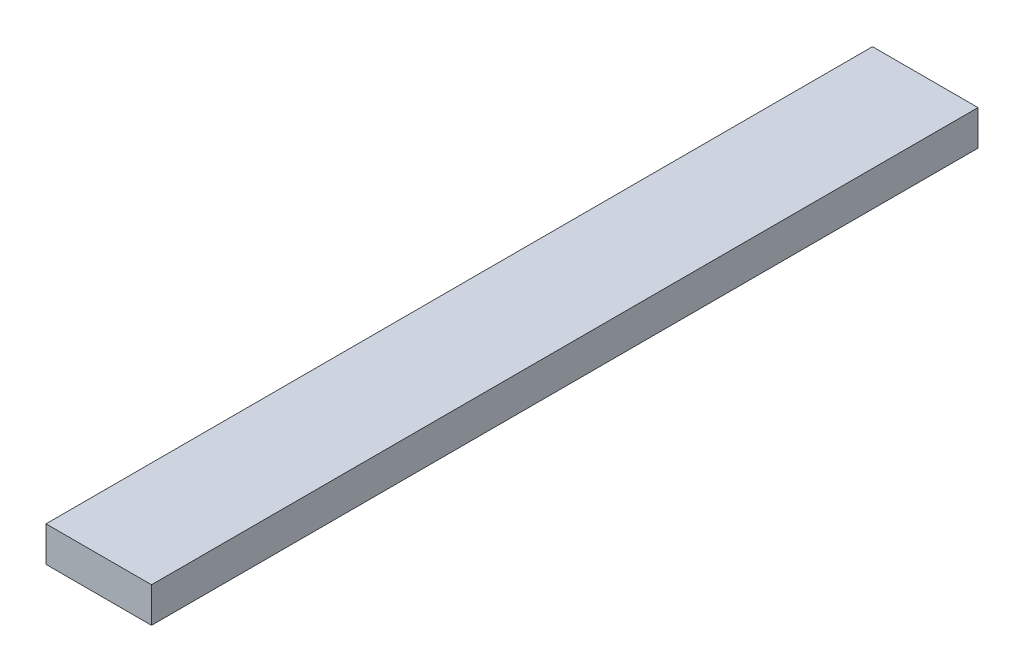
ISO-10303-21;
HEADER;
FILE_DESCRIPTION(('STEP AP214'),'2;1');
FILE_NAME('part.step','',(''),(''),'','','');
FILE_SCHEMA(('AUTOMOTIVE_DESIGN { 1 0 10303 214 1 1 1 1 }'));
ENDSEC;
DATA;
#1=APPLICATION_CONTEXT('core data for automotive mechanical design processes');
#2=APPLICATION_PROTOCOL_DEFINITION('international standard','automotive_design',2000,#1);
#3=PRODUCT_CONTEXT('',#1,'mechanical');
#4=PRODUCT('Part','Part','',(#3));
#5=PRODUCT_RELATED_PRODUCT_CATEGORY('part','',(#4));
#6=PRODUCT_DEFINITION_FORMATION('','',#4);
#7=PRODUCT_DEFINITION_CONTEXT('part definition',#1,'design');
#8=PRODUCT_DEFINITION('design','',#6,#7);
#9=PRODUCT_DEFINITION_SHAPE('','',#8);
#10=(LENGTH_UNIT() NAMED_UNIT(*) SI_UNIT(.MILLI.,.METRE.));
#11=(NAMED_UNIT(*) PLANE_ANGLE_UNIT() SI_UNIT($,.RADIAN.));
#12=(NAMED_UNIT(*) SI_UNIT($,.STERADIAN.) SOLID_ANGLE_UNIT());
#13=UNCERTAINTY_MEASURE_WITH_UNIT(LENGTH_MEASURE(1.E-05),#10,'distance_accuracy_value','');
#14=(GEOMETRIC_REPRESENTATION_CONTEXT(3) GLOBAL_UNCERTAINTY_ASSIGNED_CONTEXT((#13)) GLOBAL_UNIT_ASSIGNED_CONTEXT((#10,
#11,#12)) REPRESENTATION_CONTEXT('',''));
#15=CARTESIAN_POINT('',(0.,0.,0.));
#16=DIRECTION('',(0.,0.,1.));
#17=DIRECTION('',(1.,0.,0.));
#18=AXIS2_PLACEMENT_3D('',#15,#16,#17);
#19=CARTESIAN_POINT('',(0.,0.,-470.));
#20=DIRECTION('',(-1.,0.,0.));
#21=DIRECTION('',(0.,0.,1.));
#22=AXIS2_PLACEMENT_3D('',#19,#20,#21);
#23=PLANE('',#22);
#24=DIRECTION('',(0.,-1.,0.));
#25=VECTOR('',#24,1.);
#26=CARTESIAN_POINT('',(0.,0.,0.));
#27=LINE('',#26,#25);
#28=CARTESIAN_POINT('',(0.,20.,0.));
#29=VERTEX_POINT('',#28);
#30=CARTESIAN_POINT('',(0.,0.,0.));
#31=VERTEX_POINT('',#30);
#32=EDGE_CURVE('E99',#29,#31,#27,.T.);
#33=ORIENTED_EDGE('',*,*,#32,.F.);
#34=DIRECTION('',(0.,0.,1.));
#35=VECTOR('',#34,1.);
#36=CARTESIAN_POINT('',(0.,20.,-470.));
#37=LINE('',#36,#35);
#38=CARTESIAN_POINT('',(0.,20.,-470.));
#39=VERTEX_POINT('',#38);
#40=EDGE_CURVE('E11',#39,#29,#37,.T.);
#41=ORIENTED_EDGE('',*,*,#40,.F.);
#42=DIRECTION('',(0.,-1.,0.));
#43=VECTOR('',#42,1.);
#44=CARTESIAN_POINT('',(0.,0.,-470.));
#45=LINE('',#44,#43);
#46=CARTESIAN_POINT('',(0.,0.,-470.));
#47=VERTEX_POINT('',#46);
#48=EDGE_CURVE('E93',#39,#47,#45,.T.);
#49=ORIENTED_EDGE('',*,*,#48,.T.);
#50=DIRECTION('',(0.,0.,1.));
#51=VECTOR('',#50,1.);
#52=CARTESIAN_POINT('',(0.,0.,-470.));
#53=LINE('',#52,#51);
#54=EDGE_CURVE('E38',#47,#31,#53,.T.);
#55=ORIENTED_EDGE('',*,*,#54,.T.);
#56=EDGE_LOOP('',(#33,#41,#49,#55));
#57=FACE_BOUND('',#56,.T.);
#58=ADVANCED_FACE('F35',(#57),#23,.T.);
#59=CARTESIAN_POINT('',(0.,20.,-470.));
#60=DIRECTION('',(0.,1.,0.));
#61=DIRECTION('',(0.,0.,1.));
#62=AXIS2_PLACEMENT_3D('',#59,#60,#61);
#63=PLANE('',#62);
#64=DIRECTION('',(-1.,0.,0.));
#65=VECTOR('',#64,1.);
#66=CARTESIAN_POINT('',(0.,20.,0.));
#67=LINE('',#66,#65);
#68=CARTESIAN_POINT('',(60.,20.,0.));
#69=VERTEX_POINT('',#68);
#70=EDGE_CURVE('E95',#69,#29,#67,.T.);
#71=ORIENTED_EDGE('',*,*,#70,.F.);
#72=DIRECTION('',(0.,0.,1.));
#73=VECTOR('',#72,1.);
#74=CARTESIAN_POINT('',(60.,20.,-470.));
#75=LINE('',#74,#73);
#76=CARTESIAN_POINT('',(60.,20.,-470.));
#77=VERTEX_POINT('',#76);
#78=EDGE_CURVE('E44',#77,#69,#75,.T.);
#79=ORIENTED_EDGE('',*,*,#78,.F.);
#80=DIRECTION('',(-1.,0.,0.));
#81=VECTOR('',#80,1.);
#82=CARTESIAN_POINT('',(0.,20.,-470.));
#83=LINE('',#82,#81);
#84=EDGE_CURVE('E90',#77,#39,#83,.T.);
#85=ORIENTED_EDGE('',*,*,#84,.T.);
#86=ORIENTED_EDGE('',*,*,#40,.T.);
#87=EDGE_LOOP('',(#71,#79,#85,#86));
#88=FACE_BOUND('',#87,.T.);
#89=ADVANCED_FACE('F109',(#88),#63,.T.);
#90=CARTESIAN_POINT('',(60.,0.,-470.));
#91=DIRECTION('',(1.,0.,0.));
#92=DIRECTION('',(0.,0.,-1.));
#93=AXIS2_PLACEMENT_3D('',#90,#91,#92);
#94=PLANE('',#93);
#95=DIRECTION('',(0.,1.,0.));
#96=VECTOR('',#95,1.);
#97=CARTESIAN_POINT('',(60.,0.,0.));
#98=LINE('',#97,#96);
#99=CARTESIAN_POINT('',(60.,0.,0.));
#100=VERTEX_POINT('',#99);
#101=EDGE_CURVE('E85',#100,#69,#98,.T.);
#102=ORIENTED_EDGE('',*,*,#101,.F.);
#103=DIRECTION('',(0.,0.,1.));
#104=VECTOR('',#103,1.);
#105=CARTESIAN_POINT('',(60.,0.,-470.));
#106=LINE('',#105,#104);
#107=CARTESIAN_POINT('',(60.,0.,-470.));
#108=VERTEX_POINT('',#107);
#109=EDGE_CURVE('E80',#108,#100,#106,.T.);
#110=ORIENTED_EDGE('',*,*,#109,.F.);
#111=DIRECTION('',(0.,1.,0.));
#112=VECTOR('',#111,1.);
#113=CARTESIAN_POINT('',(60.,0.,-470.));
#114=LINE('',#113,#112);
#115=EDGE_CURVE('E83',#108,#77,#114,.T.);
#116=ORIENTED_EDGE('',*,*,#115,.T.);
#117=ORIENTED_EDGE('',*,*,#78,.T.);
#118=EDGE_LOOP('',(#102,#110,#116,#117));
#119=FACE_BOUND('',#118,.T.);
#120=ADVANCED_FACE('F82',(#119),#94,.T.);
#121=CARTESIAN_POINT('',(0.,0.,-470.));
#122=DIRECTION('',(0.,-1.,0.));
#123=DIRECTION('',(0.,0.,-1.));
#124=AXIS2_PLACEMENT_3D('',#121,#122,#123);
#125=PLANE('',#124);
#126=DIRECTION('',(1.,0.,0.));
#127=VECTOR('',#126,1.);
#128=CARTESIAN_POINT('',(0.,0.,0.));
#129=LINE('',#128,#127);
#130=EDGE_CURVE('E102',#31,#100,#129,.T.);
#131=ORIENTED_EDGE('',*,*,#130,.F.);
#132=ORIENTED_EDGE('',*,*,#54,.F.);
#133=DIRECTION('',(1.,0.,0.));
#134=VECTOR('',#133,1.);
#135=CARTESIAN_POINT('',(0.,0.,-470.));
#136=LINE('',#135,#134);
#137=EDGE_CURVE('E89',#47,#108,#136,.T.);
#138=ORIENTED_EDGE('',*,*,#137,.T.);
#139=ORIENTED_EDGE('',*,*,#109,.T.);
#140=EDGE_LOOP('',(#131,#132,#138,#139));
#141=FACE_BOUND('',#140,.T.);
#142=ADVANCED_FACE('F92',(#141),#125,.T.);
#143=CARTESIAN_POINT('',(0.,0.,-470.));
#144=DIRECTION('',(0.,0.,-1.));
#145=DIRECTION('',(-1.,0.,0.));
#146=AXIS2_PLACEMENT_3D('',#143,#144,#145);
#147=PLANE('',#146);
#148=ORIENTED_EDGE('',*,*,#48,.F.);
#149=ORIENTED_EDGE('',*,*,#84,.F.);
#150=ORIENTED_EDGE('',*,*,#115,.F.);
#151=ORIENTED_EDGE('',*,*,#137,.F.);
#152=EDGE_LOOP('',(#148,#149,#150,#151));
#153=FACE_BOUND('',#152,.T.);
#154=ADVANCED_FACE('F88',(#153),#147,.T.);
#155=CARTESIAN_POINT('',(0.,0.,0.));
#156=DIRECTION('',(0.,0.,-1.));
#157=DIRECTION('',(-1.,0.,0.));
#158=AXIS2_PLACEMENT_3D('',#155,#156,#157);
#159=PLANE('',#158);
#160=ORIENTED_EDGE('',*,*,#32,.T.);
#161=ORIENTED_EDGE('',*,*,#130,.T.);
#162=ORIENTED_EDGE('',*,*,#101,.T.);
#163=ORIENTED_EDGE('',*,*,#70,.T.);
#164=EDGE_LOOP('',(#160,#161,#162,#163));
#165=FACE_BOUND('',#164,.T.);
#166=ADVANCED_FACE('F108',(#165),#159,.F.);
#167=CLOSED_SHELL('',(#58,#89,#120,#142,#154,#166));
#168=MANIFOLD_SOLID_BREP('B2',#167);
#169=ADVANCED_BREP_SHAPE_REPRESENTATION('',(#18,#168),#14);
#170=SHAPE_DEFINITION_REPRESENTATION(#9,#169);
ENDSEC;
END-ISO-10303-21;
